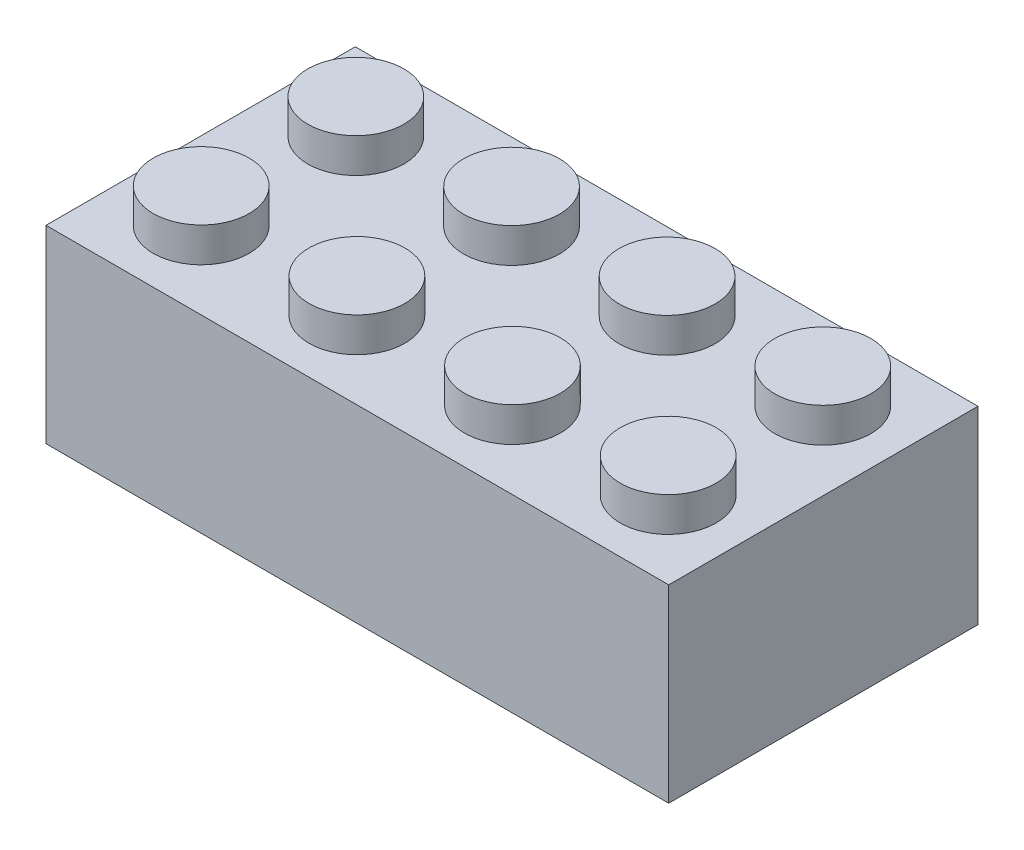
ISO-10303-21;
HEADER;
FILE_DESCRIPTION(('STEP AP214'),'2;1');
FILE_NAME('part.step','',(''),(''),'','','');
FILE_SCHEMA(('AUTOMOTIVE_DESIGN { 1 0 10303 214 1 1 1 1 }'));
ENDSEC;
DATA;
#1=APPLICATION_CONTEXT('core data for automotive mechanical design processes');
#2=APPLICATION_PROTOCOL_DEFINITION('international standard','automotive_design',2000,#1);
#3=PRODUCT_CONTEXT('',#1,'mechanical');
#4=PRODUCT('Part','Part','',(#3));
#5=PRODUCT_RELATED_PRODUCT_CATEGORY('part','',(#4));
#6=PRODUCT_DEFINITION_FORMATION('','',#4);
#7=PRODUCT_DEFINITION_CONTEXT('part definition',#1,'design');
#8=PRODUCT_DEFINITION('design','',#6,#7);
#9=PRODUCT_DEFINITION_SHAPE('','',#8);
#10=(LENGTH_UNIT() NAMED_UNIT(*) SI_UNIT(.MILLI.,.METRE.));
#11=(NAMED_UNIT(*) PLANE_ANGLE_UNIT() SI_UNIT($,.RADIAN.));
#12=(NAMED_UNIT(*) SI_UNIT($,.STERADIAN.) SOLID_ANGLE_UNIT());
#13=UNCERTAINTY_MEASURE_WITH_UNIT(LENGTH_MEASURE(1.E-05),#10,'distance_accuracy_value','');
#14=(GEOMETRIC_REPRESENTATION_CONTEXT(3) GLOBAL_UNCERTAINTY_ASSIGNED_CONTEXT((#13)) GLOBAL_UNIT_ASSIGNED_CONTEXT((#10,
#11,#12)) REPRESENTATION_CONTEXT('',''));
#15=CARTESIAN_POINT('',(0.,0.,0.));
#16=DIRECTION('',(0.,0.,1.));
#17=DIRECTION('',(1.,0.,0.));
#18=AXIS2_PLACEMENT_3D('',#15,#16,#17);
#19=CARTESIAN_POINT('',(15.885,-9.65,-7.89));
#20=DIRECTION('',(1.,0.,0.));
#21=DIRECTION('',(0.,0.,-1.));
#22=AXIS2_PLACEMENT_3D('',#19,#20,#21);
#23=PLANE('',#22);
#24=DIRECTION('',(0.,0.,-1.));
#25=VECTOR('',#24,1.);
#26=CARTESIAN_POINT('',(15.885,0.,-7.89));
#27=LINE('',#26,#25);
#28=CARTESIAN_POINT('',(15.885,0.,7.89));
#29=VERTEX_POINT('',#28);
#30=CARTESIAN_POINT('',(15.885,0.,-7.89));
#31=VERTEX_POINT('',#30);
#32=EDGE_CURVE('E243',#29,#31,#27,.T.);
#33=ORIENTED_EDGE('',*,*,#32,.F.);
#34=DIRECTION('',(0.,1.,0.));
#35=VECTOR('',#34,1.);
#36=CARTESIAN_POINT('',(15.885,-9.65,7.89));
#37=LINE('',#36,#35);
#38=CARTESIAN_POINT('',(15.885,-9.65,7.89));
#39=VERTEX_POINT('',#38);
#40=EDGE_CURVE('E58',#39,#29,#37,.T.);
#41=ORIENTED_EDGE('',*,*,#40,.F.);
#42=DIRECTION('',(0.,0.,-1.));
#43=VECTOR('',#42,1.);
#44=CARTESIAN_POINT('',(15.885,-9.65,-7.89));
#45=LINE('',#44,#43);
#46=CARTESIAN_POINT('',(15.885,-9.65,-7.89));
#47=VERTEX_POINT('',#46);
#48=EDGE_CURVE('E246',#39,#47,#45,.T.);
#49=ORIENTED_EDGE('',*,*,#48,.T.);
#50=DIRECTION('',(0.,1.,0.));
#51=VECTOR('',#50,1.);
#52=CARTESIAN_POINT('',(15.885,-9.65,-7.89));
#53=LINE('',#52,#51);
#54=EDGE_CURVE('E84',#47,#31,#53,.T.);
#55=ORIENTED_EDGE('',*,*,#54,.T.);
#56=EDGE_LOOP('',(#33,#41,#49,#55));
#57=FACE_BOUND('',#56,.T.);
#58=ADVANCED_FACE('F35',(#57),#23,.T.);
#59=CARTESIAN_POINT('',(-15.885,-9.65,7.89));
#60=DIRECTION('',(0.,0.,1.));
#61=DIRECTION('',(1.,0.,0.));
#62=AXIS2_PLACEMENT_3D('',#59,#60,#61);
#63=PLANE('',#62);
#64=DIRECTION('',(1.,0.,0.));
#65=VECTOR('',#64,1.);
#66=CARTESIAN_POINT('',(-15.885,0.,7.89));
#67=LINE('',#66,#65);
#68=CARTESIAN_POINT('',(-15.885,0.,7.89));
#69=VERTEX_POINT('',#68);
#70=EDGE_CURVE('E249',#69,#29,#67,.T.);
#71=ORIENTED_EDGE('',*,*,#70,.F.);
#72=DIRECTION('',(0.,1.,0.));
#73=VECTOR('',#72,1.);
#74=CARTESIAN_POINT('',(-15.885,-9.65,7.89));
#75=LINE('',#74,#73);
#76=CARTESIAN_POINT('',(-15.885,-9.65,7.89));
#77=VERTEX_POINT('',#76);
#78=EDGE_CURVE('E268',#77,#69,#75,.T.);
#79=ORIENTED_EDGE('',*,*,#78,.F.);
#80=DIRECTION('',(1.,0.,0.));
#81=VECTOR('',#80,1.);
#82=CARTESIAN_POINT('',(-15.885,-9.65,7.89));
#83=LINE('',#82,#81);
#84=EDGE_CURVE('E254',#77,#39,#83,.T.);
#85=ORIENTED_EDGE('',*,*,#84,.T.);
#86=ORIENTED_EDGE('',*,*,#40,.T.);
#87=EDGE_LOOP('',(#71,#79,#85,#86));
#88=FACE_BOUND('',#87,.T.);
#89=ADVANCED_FACE('F316',(#88),#63,.T.);
#90=CARTESIAN_POINT('',(-15.885,-9.65,-7.89));
#91=DIRECTION('',(-1.,0.,0.));
#92=DIRECTION('',(0.,0.,1.));
#93=AXIS2_PLACEMENT_3D('',#90,#91,#92);
#94=PLANE('',#93);
#95=DIRECTION('',(0.,0.,1.));
#96=VECTOR('',#95,1.);
#97=CARTESIAN_POINT('',(-15.885,0.,-7.89));
#98=LINE('',#97,#96);
#99=CARTESIAN_POINT('',(-15.885,0.,-7.89));
#100=VERTEX_POINT('',#99);
#101=EDGE_CURVE('E261',#100,#69,#98,.T.);
#102=ORIENTED_EDGE('',*,*,#101,.F.);
#103=DIRECTION('',(0.,1.,0.));
#104=VECTOR('',#103,1.);
#105=CARTESIAN_POINT('',(-15.885,-9.65,-7.89));
#106=LINE('',#105,#104);
#107=CARTESIAN_POINT('',(-15.885,-9.65,-7.89));
#108=VERTEX_POINT('',#107);
#109=EDGE_CURVE('E270',#108,#100,#106,.T.);
#110=ORIENTED_EDGE('',*,*,#109,.F.);
#111=DIRECTION('',(0.,0.,1.));
#112=VECTOR('',#111,1.);
#113=CARTESIAN_POINT('',(-15.885,-9.65,-7.89));
#114=LINE('',#113,#112);
#115=EDGE_CURVE('E251',#108,#77,#114,.T.);
#116=ORIENTED_EDGE('',*,*,#115,.T.);
#117=ORIENTED_EDGE('',*,*,#78,.T.);
#118=EDGE_LOOP('',(#102,#110,#116,#117));
#119=FACE_BOUND('',#118,.T.);
#120=ADVANCED_FACE('F320',(#119),#94,.T.);
#121=CARTESIAN_POINT('',(-15.885,-9.65,-7.89));
#122=DIRECTION('',(0.,0.,-1.));
#123=DIRECTION('',(-1.,0.,0.));
#124=AXIS2_PLACEMENT_3D('',#121,#122,#123);
#125=PLANE('',#124);
#126=DIRECTION('',(-1.,0.,0.));
#127=VECTOR('',#126,1.);
#128=CARTESIAN_POINT('',(-15.885,0.,-7.89));
#129=LINE('',#128,#127);
#130=EDGE_CURVE('E258',#31,#100,#129,.T.);
#131=ORIENTED_EDGE('',*,*,#130,.F.);
#132=ORIENTED_EDGE('',*,*,#54,.F.);
#133=DIRECTION('',(-1.,0.,0.));
#134=VECTOR('',#133,1.);
#135=CARTESIAN_POINT('',(-15.885,-9.65,-7.89));
#136=LINE('',#135,#134);
#137=EDGE_CURVE('E248',#47,#108,#136,.T.);
#138=ORIENTED_EDGE('',*,*,#137,.T.);
#139=ORIENTED_EDGE('',*,*,#109,.T.);
#140=EDGE_LOOP('',(#131,#132,#138,#139));
#141=FACE_BOUND('',#140,.T.);
#142=ADVANCED_FACE('F330',(#141),#125,.T.);
#143=CARTESIAN_POINT('',(0.,-9.65,0.));
#144=DIRECTION('',(0.,1.,0.));
#145=DIRECTION('',(0.,0.,1.));
#146=AXIS2_PLACEMENT_3D('',#143,#144,#145);
#147=PLANE('',#146);
#148=DIRECTION('',(1.,0.,0.));
#149=VECTOR('',#148,1.);
#150=CARTESIAN_POINT('',(0.,-9.65,6.69));
#151=LINE('',#150,#149);
#152=CARTESIAN_POINT('',(-14.685,-9.65,6.69));
#153=VERTEX_POINT('',#152);
#154=CARTESIAN_POINT('',(14.685,-9.65,6.69));
#155=VERTEX_POINT('',#154);
#156=EDGE_CURVE('E193',#153,#155,#151,.T.);
#157=ORIENTED_EDGE('',*,*,#156,.T.);
#158=DIRECTION('',(0.,0.,-1.));
#159=VECTOR('',#158,1.);
#160=CARTESIAN_POINT('',(14.685,-9.65,0.));
#161=LINE('',#160,#159);
#162=CARTESIAN_POINT('',(14.685,-9.65,-6.69));
#163=VERTEX_POINT('',#162);
#164=EDGE_CURVE('E113',#155,#163,#161,.T.);
#165=ORIENTED_EDGE('',*,*,#164,.T.);
#166=DIRECTION('',(-1.,0.,0.));
#167=VECTOR('',#166,1.);
#168=CARTESIAN_POINT('',(0.,-9.65,-6.69));
#169=LINE('',#168,#167);
#170=CARTESIAN_POINT('',(-14.685,-9.65,-6.69));
#171=VERTEX_POINT('',#170);
#172=EDGE_CURVE('E135',#163,#171,#169,.T.);
#173=ORIENTED_EDGE('',*,*,#172,.T.);
#174=DIRECTION('',(0.,0.,1.));
#175=VECTOR('',#174,1.);
#176=CARTESIAN_POINT('',(-14.685,-9.65,0.));
#177=LINE('',#176,#175);
#178=EDGE_CURVE('E49',#171,#153,#177,.T.);
#179=ORIENTED_EDGE('',*,*,#178,.T.);
#180=EDGE_LOOP('',(#157,#165,#173,#179));
#181=FACE_BOUND('',#180,.T.);
#182=ORIENTED_EDGE('',*,*,#48,.F.);
#183=ORIENTED_EDGE('',*,*,#84,.F.);
#184=ORIENTED_EDGE('',*,*,#115,.F.);
#185=ORIENTED_EDGE('',*,*,#137,.F.);
#186=EDGE_LOOP('',(#182,#183,#184,#185));
#187=FACE_BOUND('',#186,.T.);
#188=ADVANCED_FACE('F329',(#181,#187),#147,.F.);
#189=CARTESIAN_POINT('',(0.,0.,0.));
#190=DIRECTION('',(0.,1.,0.));
#191=DIRECTION('',(0.,0.,1.));
#192=AXIS2_PLACEMENT_3D('',#189,#190,#191);
#193=PLANE('',#192);
#194=CARTESIAN_POINT('',(11.9125,0.,-3.945));
#195=DIRECTION('',(0.,1.,0.));
#196=DIRECTION('',(0.,0.,-1.));
#197=AXIS2_PLACEMENT_3D('',#194,#195,#196);
#198=CIRCLE('',#197,2.45);
#199=CARTESIAN_POINT('',(11.9125,0.,-6.395));
#200=VERTEX_POINT('',#199);
#201=EDGE_CURVE('E118',#200,#200,#198,.T.);
#202=ORIENTED_EDGE('',*,*,#201,.F.);
#203=EDGE_LOOP('',(#202));
#204=FACE_BOUND('',#203,.T.);
#205=CARTESIAN_POINT('',(3.9675,0.,-3.945));
#206=DIRECTION('',(0.,1.,0.));
#207=DIRECTION('',(0.,0.,-1.));
#208=AXIS2_PLACEMENT_3D('',#205,#206,#207);
#209=CIRCLE('',#208,2.45);
#210=CARTESIAN_POINT('',(3.9675,0.,-6.395));
#211=VERTEX_POINT('',#210);
#212=EDGE_CURVE('E201',#211,#211,#209,.T.);
#213=ORIENTED_EDGE('',*,*,#212,.F.);
#214=EDGE_LOOP('',(#213));
#215=FACE_BOUND('',#214,.T.);
#216=CARTESIAN_POINT('',(3.9675,0.,3.945));
#217=DIRECTION('',(0.,1.,0.));
#218=DIRECTION('',(0.,0.,-1.));
#219=AXIS2_PLACEMENT_3D('',#216,#217,#218);
#220=CIRCLE('',#219,2.45);
#221=CARTESIAN_POINT('',(3.9675,0.,1.495));
#222=VERTEX_POINT('',#221);
#223=EDGE_CURVE('E207',#222,#222,#220,.T.);
#224=ORIENTED_EDGE('',*,*,#223,.F.);
#225=EDGE_LOOP('',(#224));
#226=FACE_BOUND('',#225,.T.);
#227=CARTESIAN_POINT('',(11.9125,0.,3.945));
#228=DIRECTION('',(0.,1.,0.));
#229=DIRECTION('',(0.,0.,-1.));
#230=AXIS2_PLACEMENT_3D('',#227,#228,#229);
#231=CIRCLE('',#230,2.45);
#232=CARTESIAN_POINT('',(11.9125,0.,1.495));
#233=VERTEX_POINT('',#232);
#234=EDGE_CURVE('E213',#233,#233,#231,.T.);
#235=ORIENTED_EDGE('',*,*,#234,.F.);
#236=EDGE_LOOP('',(#235));
#237=FACE_BOUND('',#236,.T.);
#238=CARTESIAN_POINT('',(-11.9125,0.,3.945));
#239=DIRECTION('',(0.,1.,0.));
#240=DIRECTION('',(0.,0.,1.));
#241=AXIS2_PLACEMENT_3D('',#238,#239,#240);
#242=CIRCLE('',#241,2.45);
#243=CARTESIAN_POINT('',(-11.9125,0.,6.395));
#244=VERTEX_POINT('',#243);
#245=EDGE_CURVE('E219',#244,#244,#242,.T.);
#246=ORIENTED_EDGE('',*,*,#245,.F.);
#247=EDGE_LOOP('',(#246));
#248=FACE_BOUND('',#247,.T.);
#249=CARTESIAN_POINT('',(-3.9675,0.,3.945));
#250=DIRECTION('',(0.,1.,0.));
#251=DIRECTION('',(0.,0.,1.));
#252=AXIS2_PLACEMENT_3D('',#249,#250,#251);
#253=CIRCLE('',#252,2.45);
#254=CARTESIAN_POINT('',(-3.9675,0.,6.395));
#255=VERTEX_POINT('',#254);
#256=EDGE_CURVE('E225',#255,#255,#253,.T.);
#257=ORIENTED_EDGE('',*,*,#256,.F.);
#258=EDGE_LOOP('',(#257));
#259=FACE_BOUND('',#258,.T.);
#260=CARTESIAN_POINT('',(-3.9675,0.,-3.945));
#261=DIRECTION('',(0.,1.,0.));
#262=DIRECTION('',(0.,0.,1.));
#263=AXIS2_PLACEMENT_3D('',#260,#261,#262);
#264=CIRCLE('',#263,2.45);
#265=CARTESIAN_POINT('',(-3.9675,0.,-1.495));
#266=VERTEX_POINT('',#265);
#267=EDGE_CURVE('E231',#266,#266,#264,.T.);
#268=ORIENTED_EDGE('',*,*,#267,.F.);
#269=EDGE_LOOP('',(#268));
#270=FACE_BOUND('',#269,.T.);
#271=CARTESIAN_POINT('',(-11.9125,0.,-3.945));
#272=DIRECTION('',(0.,1.,0.));
#273=DIRECTION('',(0.,0.,1.));
#274=AXIS2_PLACEMENT_3D('',#271,#272,#273);
#275=CIRCLE('',#274,2.45);
#276=CARTESIAN_POINT('',(-11.9125,0.,-1.495));
#277=VERTEX_POINT('',#276);
#278=EDGE_CURVE('E237',#277,#277,#275,.T.);
#279=ORIENTED_EDGE('',*,*,#278,.F.);
#280=EDGE_LOOP('',(#279));
#281=FACE_BOUND('',#280,.T.);
#282=ORIENTED_EDGE('',*,*,#32,.T.);
#283=ORIENTED_EDGE('',*,*,#130,.T.);
#284=ORIENTED_EDGE('',*,*,#101,.T.);
#285=ORIENTED_EDGE('',*,*,#70,.T.);
#286=EDGE_LOOP('',(#282,#283,#284,#285));
#287=FACE_BOUND('',#286,.T.);
#288=ADVANCED_FACE('F323',(#204,#215,#226,#237,#248,#259,#270,#281,#287),#193,.T.);
#289=CARTESIAN_POINT('',(-11.9125,1.76,-3.945));
#290=DIRECTION('',(0.,-1.,0.));
#291=DIRECTION('',(0.,0.,-1.));
#292=AXIS2_PLACEMENT_3D('',#289,#290,#291);
#293=CYLINDRICAL_SURFACE('',#292,2.45);
#294=CARTESIAN_POINT('',(-11.9125,1.76,-3.945));
#295=DIRECTION('',(0.,1.,0.));
#296=DIRECTION('',(0.,0.,1.));
#297=AXIS2_PLACEMENT_3D('',#294,#295,#296);
#298=CIRCLE('',#297,2.45);
#299=CARTESIAN_POINT('',(-11.9125,1.76,-1.495));
#300=VERTEX_POINT('',#299);
#301=EDGE_CURVE('E240',#300,#300,#298,.T.);
#302=ORIENTED_EDGE('',*,*,#301,.F.);
#303=EDGE_LOOP('',(#302));
#304=FACE_BOUND('',#303,.T.);
#305=ORIENTED_EDGE('',*,*,#278,.T.);
#306=EDGE_LOOP('',(#305));
#307=FACE_BOUND('',#306,.T.);
#308=ADVANCED_FACE('F341',(#304,#307),#293,.T.);
#309=CARTESIAN_POINT('',(-11.9125,1.76,-3.945));
#310=DIRECTION('',(0.,1.,0.));
#311=DIRECTION('',(0.,0.,1.));
#312=AXIS2_PLACEMENT_3D('',#309,#310,#311);
#313=PLANE('',#312);
#314=ORIENTED_EDGE('',*,*,#301,.T.);
#315=EDGE_LOOP('',(#314));
#316=FACE_BOUND('',#315,.T.);
#317=ADVANCED_FACE('F346',(#316),#313,.T.);
#318=CARTESIAN_POINT('',(-3.9675,1.76,-3.945));
#319=DIRECTION('',(0.,-1.,0.));
#320=DIRECTION('',(0.,0.,-1.));
#321=AXIS2_PLACEMENT_3D('',#318,#319,#320);
#322=CYLINDRICAL_SURFACE('',#321,2.45);
#323=CARTESIAN_POINT('',(-3.9675,1.76,-3.945));
#324=DIRECTION('',(0.,1.,0.));
#325=DIRECTION('',(0.,0.,1.));
#326=AXIS2_PLACEMENT_3D('',#323,#324,#325);
#327=CIRCLE('',#326,2.45);
#328=CARTESIAN_POINT('',(-3.9675,1.76,-1.495));
#329=VERTEX_POINT('',#328);
#330=EDGE_CURVE('E234',#329,#329,#327,.T.);
#331=ORIENTED_EDGE('',*,*,#330,.F.);
#332=EDGE_LOOP('',(#331));
#333=FACE_BOUND('',#332,.T.);
#334=ORIENTED_EDGE('',*,*,#267,.T.);
#335=EDGE_LOOP('',(#334));
#336=FACE_BOUND('',#335,.T.);
#337=ADVANCED_FACE('F350',(#333,#336),#322,.T.);
#338=CARTESIAN_POINT('',(-3.9675,1.76,-3.945));
#339=DIRECTION('',(0.,1.,0.));
#340=DIRECTION('',(0.,0.,1.));
#341=AXIS2_PLACEMENT_3D('',#338,#339,#340);
#342=PLANE('',#341);
#343=ORIENTED_EDGE('',*,*,#330,.T.);
#344=EDGE_LOOP('',(#343));
#345=FACE_BOUND('',#344,.T.);
#346=ADVANCED_FACE('F354',(#345),#342,.T.);
#347=CARTESIAN_POINT('',(-3.9675,1.76,3.945));
#348=DIRECTION('',(0.,-1.,0.));
#349=DIRECTION('',(0.,0.,-1.));
#350=AXIS2_PLACEMENT_3D('',#347,#348,#349);
#351=CYLINDRICAL_SURFACE('',#350,2.45);
#352=CARTESIAN_POINT('',(-3.9675,1.76,3.945));
#353=DIRECTION('',(0.,1.,0.));
#354=DIRECTION('',(0.,0.,1.));
#355=AXIS2_PLACEMENT_3D('',#352,#353,#354);
#356=CIRCLE('',#355,2.45);
#357=CARTESIAN_POINT('',(-3.9675,1.76,6.395));
#358=VERTEX_POINT('',#357);
#359=EDGE_CURVE('E228',#358,#358,#356,.T.);
#360=ORIENTED_EDGE('',*,*,#359,.F.);
#361=EDGE_LOOP('',(#360));
#362=FACE_BOUND('',#361,.T.);
#363=ORIENTED_EDGE('',*,*,#256,.T.);
#364=EDGE_LOOP('',(#363));
#365=FACE_BOUND('',#364,.T.);
#366=ADVANCED_FACE('F358',(#362,#365),#351,.T.);
#367=CARTESIAN_POINT('',(-3.9675,1.76,3.945));
#368=DIRECTION('',(0.,1.,0.));
#369=DIRECTION('',(0.,0.,1.));
#370=AXIS2_PLACEMENT_3D('',#367,#368,#369);
#371=PLANE('',#370);
#372=ORIENTED_EDGE('',*,*,#359,.T.);
#373=EDGE_LOOP('',(#372));
#374=FACE_BOUND('',#373,.T.);
#375=ADVANCED_FACE('F362',(#374),#371,.T.);
#376=CARTESIAN_POINT('',(-11.9125,1.76,3.945));
#377=DIRECTION('',(0.,-1.,0.));
#378=DIRECTION('',(0.,0.,-1.));
#379=AXIS2_PLACEMENT_3D('',#376,#377,#378);
#380=CYLINDRICAL_SURFACE('',#379,2.45);
#381=CARTESIAN_POINT('',(-11.9125,1.76,3.945));
#382=DIRECTION('',(0.,1.,0.));
#383=DIRECTION('',(0.,0.,1.));
#384=AXIS2_PLACEMENT_3D('',#381,#382,#383);
#385=CIRCLE('',#384,2.45);
#386=CARTESIAN_POINT('',(-11.9125,1.76,6.395));
#387=VERTEX_POINT('',#386);
#388=EDGE_CURVE('E222',#387,#387,#385,.T.);
#389=ORIENTED_EDGE('',*,*,#388,.F.);
#390=EDGE_LOOP('',(#389));
#391=FACE_BOUND('',#390,.T.);
#392=ORIENTED_EDGE('',*,*,#245,.T.);
#393=EDGE_LOOP('',(#392));
#394=FACE_BOUND('',#393,.T.);
#395=ADVANCED_FACE('F366',(#391,#394),#380,.T.);
#396=CARTESIAN_POINT('',(-11.9125,1.76,3.945));
#397=DIRECTION('',(0.,1.,0.));
#398=DIRECTION('',(0.,0.,1.));
#399=AXIS2_PLACEMENT_3D('',#396,#397,#398);
#400=PLANE('',#399);
#401=ORIENTED_EDGE('',*,*,#388,.T.);
#402=EDGE_LOOP('',(#401));
#403=FACE_BOUND('',#402,.T.);
#404=ADVANCED_FACE('F370',(#403),#400,.T.);
#405=CARTESIAN_POINT('',(11.9125,1.76,3.945));
#406=DIRECTION('',(0.,-1.,0.));
#407=DIRECTION('',(0.,0.,-1.));
#408=AXIS2_PLACEMENT_3D('',#405,#406,#407);
#409=CYLINDRICAL_SURFACE('',#408,2.45);
#410=CARTESIAN_POINT('',(11.9125,1.76,3.945));
#411=DIRECTION('',(0.,1.,0.));
#412=DIRECTION('',(0.,0.,-1.));
#413=AXIS2_PLACEMENT_3D('',#410,#411,#412);
#414=CIRCLE('',#413,2.45);
#415=CARTESIAN_POINT('',(11.9125,1.76,1.495));
#416=VERTEX_POINT('',#415);
#417=EDGE_CURVE('E216',#416,#416,#414,.T.);
#418=ORIENTED_EDGE('',*,*,#417,.F.);
#419=EDGE_LOOP('',(#418));
#420=FACE_BOUND('',#419,.T.);
#421=ORIENTED_EDGE('',*,*,#234,.T.);
#422=EDGE_LOOP('',(#421));
#423=FACE_BOUND('',#422,.T.);
#424=ADVANCED_FACE('F374',(#420,#423),#409,.T.);
#425=CARTESIAN_POINT('',(11.9125,1.76,3.945));
#426=DIRECTION('',(0.,-1.,0.));
#427=DIRECTION('',(0.,0.,-1.));
#428=AXIS2_PLACEMENT_3D('',#425,#426,#427);
#429=PLANE('',#428);
#430=ORIENTED_EDGE('',*,*,#417,.T.);
#431=EDGE_LOOP('',(#430));
#432=FACE_BOUND('',#431,.T.);
#433=ADVANCED_FACE('F378',(#432),#429,.F.);
#434=CARTESIAN_POINT('',(3.9675,1.76,3.945));
#435=DIRECTION('',(0.,-1.,0.));
#436=DIRECTION('',(0.,0.,-1.));
#437=AXIS2_PLACEMENT_3D('',#434,#435,#436);
#438=CYLINDRICAL_SURFACE('',#437,2.45);
#439=CARTESIAN_POINT('',(3.9675,1.76,3.945));
#440=DIRECTION('',(0.,1.,0.));
#441=DIRECTION('',(0.,0.,-1.));
#442=AXIS2_PLACEMENT_3D('',#439,#440,#441);
#443=CIRCLE('',#442,2.45);
#444=CARTESIAN_POINT('',(3.9675,1.76,1.495));
#445=VERTEX_POINT('',#444);
#446=EDGE_CURVE('E210',#445,#445,#443,.T.);
#447=ORIENTED_EDGE('',*,*,#446,.F.);
#448=EDGE_LOOP('',(#447));
#449=FACE_BOUND('',#448,.T.);
#450=ORIENTED_EDGE('',*,*,#223,.T.);
#451=EDGE_LOOP('',(#450));
#452=FACE_BOUND('',#451,.T.);
#453=ADVANCED_FACE('F382',(#449,#452),#438,.T.);
#454=CARTESIAN_POINT('',(3.9675,1.76,3.945));
#455=DIRECTION('',(0.,-1.,0.));
#456=DIRECTION('',(0.,0.,-1.));
#457=AXIS2_PLACEMENT_3D('',#454,#455,#456);
#458=PLANE('',#457);
#459=ORIENTED_EDGE('',*,*,#446,.T.);
#460=EDGE_LOOP('',(#459));
#461=FACE_BOUND('',#460,.T.);
#462=ADVANCED_FACE('F386',(#461),#458,.F.);
#463=CARTESIAN_POINT('',(3.9675,1.76,-3.945));
#464=DIRECTION('',(0.,-1.,0.));
#465=DIRECTION('',(0.,0.,-1.));
#466=AXIS2_PLACEMENT_3D('',#463,#464,#465);
#467=CYLINDRICAL_SURFACE('',#466,2.45);
#468=CARTESIAN_POINT('',(3.9675,1.76,-3.945));
#469=DIRECTION('',(0.,1.,0.));
#470=DIRECTION('',(0.,0.,-1.));
#471=AXIS2_PLACEMENT_3D('',#468,#469,#470);
#472=CIRCLE('',#471,2.45);
#473=CARTESIAN_POINT('',(3.9675,1.76,-6.395));
#474=VERTEX_POINT('',#473);
#475=EDGE_CURVE('E204',#474,#474,#472,.T.);
#476=ORIENTED_EDGE('',*,*,#475,.F.);
#477=EDGE_LOOP('',(#476));
#478=FACE_BOUND('',#477,.T.);
#479=ORIENTED_EDGE('',*,*,#212,.T.);
#480=EDGE_LOOP('',(#479));
#481=FACE_BOUND('',#480,.T.);
#482=ADVANCED_FACE('F390',(#478,#481),#467,.T.);
#483=CARTESIAN_POINT('',(3.9675,1.76,-3.945));
#484=DIRECTION('',(0.,-1.,0.));
#485=DIRECTION('',(0.,0.,-1.));
#486=AXIS2_PLACEMENT_3D('',#483,#484,#485);
#487=PLANE('',#486);
#488=ORIENTED_EDGE('',*,*,#475,.T.);
#489=EDGE_LOOP('',(#488));
#490=FACE_BOUND('',#489,.T.);
#491=ADVANCED_FACE('F394',(#490),#487,.F.);
#492=CARTESIAN_POINT('',(11.9125,1.76,-3.945));
#493=DIRECTION('',(0.,-1.,0.));
#494=DIRECTION('',(0.,0.,-1.));
#495=AXIS2_PLACEMENT_3D('',#492,#493,#494);
#496=CYLINDRICAL_SURFACE('',#495,2.45);
#497=CARTESIAN_POINT('',(11.9125,1.76,-3.945));
#498=DIRECTION('',(0.,1.,0.));
#499=DIRECTION('',(0.,0.,-1.));
#500=AXIS2_PLACEMENT_3D('',#497,#498,#499);
#501=CIRCLE('',#500,2.45);
#502=CARTESIAN_POINT('',(11.9125,1.76,-6.395));
#503=VERTEX_POINT('',#502);
#504=EDGE_CURVE('E198',#503,#503,#501,.T.);
#505=ORIENTED_EDGE('',*,*,#504,.F.);
#506=EDGE_LOOP('',(#505));
#507=FACE_BOUND('',#506,.T.);
#508=ORIENTED_EDGE('',*,*,#201,.T.);
#509=EDGE_LOOP('',(#508));
#510=FACE_BOUND('',#509,.T.);
#511=ADVANCED_FACE('F398',(#507,#510),#496,.T.);
#512=CARTESIAN_POINT('',(11.9125,1.76,-3.945));
#513=DIRECTION('',(0.,-1.,0.));
#514=DIRECTION('',(0.,0.,-1.));
#515=AXIS2_PLACEMENT_3D('',#512,#513,#514);
#516=PLANE('',#515);
#517=ORIENTED_EDGE('',*,*,#504,.T.);
#518=EDGE_LOOP('',(#517));
#519=FACE_BOUND('',#518,.T.);
#520=ADVANCED_FACE('F402',(#519),#516,.F.);
#521=CARTESIAN_POINT('',(14.685,-9.65,-7.89));
#522=DIRECTION('',(1.,0.,0.));
#523=DIRECTION('',(0.,0.,-1.));
#524=AXIS2_PLACEMENT_3D('',#521,#522,#523);
#525=PLANE('',#524);
#526=DIRECTION('',(0.,0.,-1.));
#527=VECTOR('',#526,1.);
#528=CARTESIAN_POINT('',(14.685,-1.2,0.));
#529=LINE('',#528,#527);
#530=CARTESIAN_POINT('',(14.685,-1.2,6.69));
#531=VERTEX_POINT('',#530);
#532=CARTESIAN_POINT('',(14.685,-1.2,-6.69));
#533=VERTEX_POINT('',#532);
#534=EDGE_CURVE('E111',#531,#533,#529,.T.);
#535=ORIENTED_EDGE('',*,*,#534,.T.);
#536=DIRECTION('',(0.,1.,0.));
#537=VECTOR('',#536,1.);
#538=CARTESIAN_POINT('',(14.685,-9.65,-6.69));
#539=LINE('',#538,#537);
#540=EDGE_CURVE('E140',#163,#533,#539,.T.);
#541=ORIENTED_EDGE('',*,*,#540,.F.);
#542=ORIENTED_EDGE('',*,*,#164,.F.);
#543=DIRECTION('',(0.,1.,0.));
#544=VECTOR('',#543,1.);
#545=CARTESIAN_POINT('',(14.685,-9.65,6.69));
#546=LINE('',#545,#544);
#547=EDGE_CURVE('E108',#155,#531,#546,.T.);
#548=ORIENTED_EDGE('',*,*,#547,.T.);
#549=EDGE_LOOP('',(#535,#541,#542,#548));
#550=FACE_BOUND('',#549,.T.);
#551=ADVANCED_FACE('F110',(#550),#525,.F.);
#552=CARTESIAN_POINT('',(-15.885,-9.65,6.69));
#553=DIRECTION('',(0.,0.,1.));
#554=DIRECTION('',(1.,0.,0.));
#555=AXIS2_PLACEMENT_3D('',#552,#553,#554);
#556=PLANE('',#555);
#557=DIRECTION('',(1.,0.,0.));
#558=VECTOR('',#557,1.);
#559=CARTESIAN_POINT('',(0.,-1.2,6.69));
#560=LINE('',#559,#558);
#561=CARTESIAN_POINT('',(-14.685,-1.2,6.69));
#562=VERTEX_POINT('',#561);
#563=EDGE_CURVE('E126',#562,#531,#560,.T.);
#564=ORIENTED_EDGE('',*,*,#563,.T.);
#565=ORIENTED_EDGE('',*,*,#547,.F.);
#566=ORIENTED_EDGE('',*,*,#156,.F.);
#567=DIRECTION('',(0.,1.,0.));
#568=VECTOR('',#567,1.);
#569=CARTESIAN_POINT('',(-14.685,-9.65,6.69));
#570=LINE('',#569,#568);
#571=EDGE_CURVE('E119',#153,#562,#570,.T.);
#572=ORIENTED_EDGE('',*,*,#571,.T.);
#573=EDGE_LOOP('',(#564,#565,#566,#572));
#574=FACE_BOUND('',#573,.T.);
#575=ADVANCED_FACE('F131',(#574),#556,.F.);
#576=CARTESIAN_POINT('',(-14.685,-9.65,-7.89));
#577=DIRECTION('',(-1.,0.,0.));
#578=DIRECTION('',(0.,0.,1.));
#579=AXIS2_PLACEMENT_3D('',#576,#577,#578);
#580=PLANE('',#579);
#581=DIRECTION('',(0.,0.,1.));
#582=VECTOR('',#581,1.);
#583=CARTESIAN_POINT('',(-14.685,-1.2,0.));
#584=LINE('',#583,#582);
#585=CARTESIAN_POINT('',(-14.685,-1.2,-6.69));
#586=VERTEX_POINT('',#585);
#587=EDGE_CURVE('E133',#586,#562,#584,.T.);
#588=ORIENTED_EDGE('',*,*,#587,.T.);
#589=ORIENTED_EDGE('',*,*,#571,.F.);
#590=ORIENTED_EDGE('',*,*,#178,.F.);
#591=DIRECTION('',(0.,1.,0.));
#592=VECTOR('',#591,1.);
#593=CARTESIAN_POINT('',(-14.685,-9.65,-6.69));
#594=LINE('',#593,#592);
#595=EDGE_CURVE('E141',#171,#586,#594,.T.);
#596=ORIENTED_EDGE('',*,*,#595,.T.);
#597=EDGE_LOOP('',(#588,#589,#590,#596));
#598=FACE_BOUND('',#597,.T.);
#599=ADVANCED_FACE('F682',(#598),#580,.F.);
#600=CARTESIAN_POINT('',(-15.885,-9.65,-6.69));
#601=DIRECTION('',(0.,0.,-1.));
#602=DIRECTION('',(-1.,0.,0.));
#603=AXIS2_PLACEMENT_3D('',#600,#601,#602);
#604=PLANE('',#603);
#605=DIRECTION('',(-1.,0.,0.));
#606=VECTOR('',#605,1.);
#607=CARTESIAN_POINT('',(0.,-1.2,-6.69));
#608=LINE('',#607,#606);
#609=EDGE_CURVE('E128',#533,#586,#608,.T.);
#610=ORIENTED_EDGE('',*,*,#609,.T.);
#611=ORIENTED_EDGE('',*,*,#595,.F.);
#612=ORIENTED_EDGE('',*,*,#172,.F.);
#613=ORIENTED_EDGE('',*,*,#540,.T.);
#614=EDGE_LOOP('',(#610,#611,#612,#613));
#615=FACE_BOUND('',#614,.T.);
#616=ADVANCED_FACE('F282',(#615),#604,.F.);
#617=CARTESIAN_POINT('',(0.,-1.2,0.));
#618=DIRECTION('',(0.,1.,0.));
#619=DIRECTION('',(0.,0.,1.));
#620=AXIS2_PLACEMENT_3D('',#617,#618,#619);
#621=PLANE('',#620);
#622=CARTESIAN_POINT('',(-7.945,-1.2,0.));
#623=DIRECTION('',(0.,1.,0.));
#624=DIRECTION('',(0.,0.,1.));
#625=AXIS2_PLACEMENT_3D('',#622,#623,#624);
#626=CIRCLE('',#625,3.215);
#627=CARTESIAN_POINT('',(-7.945,-1.2,3.215));
#628=VERTEX_POINT('',#627);
#629=EDGE_CURVE('E12',#628,#628,#626,.F.);
#630=ORIENTED_EDGE('',*,*,#629,.F.);
#631=EDGE_LOOP('',(#630));
#632=FACE_BOUND('',#631,.T.);
#633=CARTESIAN_POINT('',(7.945,-1.2,0.));
#634=DIRECTION('',(0.,1.,0.));
#635=DIRECTION('',(0.,0.,1.));
#636=AXIS2_PLACEMENT_3D('',#633,#634,#635);
#637=CIRCLE('',#636,3.215);
#638=CARTESIAN_POINT('',(7.945,-1.2,3.215));
#639=VERTEX_POINT('',#638);
#640=EDGE_CURVE('E42',#639,#639,#637,.F.);
#641=ORIENTED_EDGE('',*,*,#640,.F.);
#642=EDGE_LOOP('',(#641));
#643=FACE_BOUND('',#642,.T.);
#644=CARTESIAN_POINT('',(0.,-1.2,0.));
#645=DIRECTION('',(0.,1.,0.));
#646=DIRECTION('',(0.,0.,1.));
#647=AXIS2_PLACEMENT_3D('',#644,#645,#646);
#648=CIRCLE('',#647,3.215);
#649=CARTESIAN_POINT('',(0.,-1.2,3.215));
#650=VERTEX_POINT('',#649);
#651=EDGE_CURVE('E267',#650,#650,#648,.F.);
#652=ORIENTED_EDGE('',*,*,#651,.F.);
#653=EDGE_LOOP('',(#652));
#654=FACE_BOUND('',#653,.T.);
#655=CARTESIAN_POINT('',(11.9125,-1.2,-3.945));
#656=DIRECTION('',(0.,1.,0.));
#657=DIRECTION('',(0.,0.,1.));
#658=AXIS2_PLACEMENT_3D('',#655,#656,#657);
#659=CIRCLE('',#658,1.25);
#660=CARTESIAN_POINT('',(11.9125,-1.2,-2.695));
#661=VERTEX_POINT('',#660);
#662=EDGE_CURVE('E145',#661,#661,#659,.T.);
#663=ORIENTED_EDGE('',*,*,#662,.T.);
#664=EDGE_LOOP('',(#663));
#665=FACE_BOUND('',#664,.T.);
#666=CARTESIAN_POINT('',(3.9675,-1.2,-3.945));
#667=DIRECTION('',(0.,1.,0.));
#668=DIRECTION('',(0.,0.,1.));
#669=AXIS2_PLACEMENT_3D('',#666,#667,#668);
#670=CIRCLE('',#669,1.25);
#671=CARTESIAN_POINT('',(3.9675,-1.2,-2.695));
#672=VERTEX_POINT('',#671);
#673=EDGE_CURVE('E150',#672,#672,#670,.T.);
#674=ORIENTED_EDGE('',*,*,#673,.T.);
#675=EDGE_LOOP('',(#674));
#676=FACE_BOUND('',#675,.T.);
#677=CARTESIAN_POINT('',(3.9675,-1.2,3.945));
#678=DIRECTION('',(0.,1.,0.));
#679=DIRECTION('',(0.,0.,1.));
#680=AXIS2_PLACEMENT_3D('',#677,#678,#679);
#681=CIRCLE('',#680,1.25);
#682=CARTESIAN_POINT('',(3.9675,-1.2,5.195));
#683=VERTEX_POINT('',#682);
#684=EDGE_CURVE('E154',#683,#683,#681,.T.);
#685=ORIENTED_EDGE('',*,*,#684,.T.);
#686=EDGE_LOOP('',(#685));
#687=FACE_BOUND('',#686,.T.);
#688=CARTESIAN_POINT('',(11.9125,-1.2,3.945));
#689=DIRECTION('',(0.,1.,0.));
#690=DIRECTION('',(0.,0.,1.));
#691=AXIS2_PLACEMENT_3D('',#688,#689,#690);
#692=CIRCLE('',#691,1.25);
#693=CARTESIAN_POINT('',(11.9125,-1.2,5.195));
#694=VERTEX_POINT('',#693);
#695=EDGE_CURVE('E158',#694,#694,#692,.T.);
#696=ORIENTED_EDGE('',*,*,#695,.T.);
#697=EDGE_LOOP('',(#696));
#698=FACE_BOUND('',#697,.T.);
#699=CARTESIAN_POINT('',(-11.9125,-1.2,3.945));
#700=DIRECTION('',(0.,1.,0.));
#701=DIRECTION('',(0.,0.,1.));
#702=AXIS2_PLACEMENT_3D('',#699,#700,#701);
#703=CIRCLE('',#702,1.25);
#704=CARTESIAN_POINT('',(-11.9125,-1.2,5.195));
#705=VERTEX_POINT('',#704);
#706=EDGE_CURVE('E162',#705,#705,#703,.T.);
#707=ORIENTED_EDGE('',*,*,#706,.T.);
#708=EDGE_LOOP('',(#707));
#709=FACE_BOUND('',#708,.T.);
#710=CARTESIAN_POINT('',(-3.9675,-1.2,3.945));
#711=DIRECTION('',(0.,1.,0.));
#712=DIRECTION('',(0.,0.,1.));
#713=AXIS2_PLACEMENT_3D('',#710,#711,#712);
#714=CIRCLE('',#713,1.25);
#715=CARTESIAN_POINT('',(-3.9675,-1.2,5.195));
#716=VERTEX_POINT('',#715);
#717=EDGE_CURVE('E166',#716,#716,#714,.T.);
#718=ORIENTED_EDGE('',*,*,#717,.T.);
#719=EDGE_LOOP('',(#718));
#720=FACE_BOUND('',#719,.T.);
#721=CARTESIAN_POINT('',(-3.9675,-1.2,-3.945));
#722=DIRECTION('',(0.,1.,0.));
#723=DIRECTION('',(0.,0.,1.));
#724=AXIS2_PLACEMENT_3D('',#721,#722,#723);
#725=CIRCLE('',#724,1.25);
#726=CARTESIAN_POINT('',(-3.9675,-1.2,-2.695));
#727=VERTEX_POINT('',#726);
#728=EDGE_CURVE('E170',#727,#727,#725,.T.);
#729=ORIENTED_EDGE('',*,*,#728,.T.);
#730=EDGE_LOOP('',(#729));
#731=FACE_BOUND('',#730,.T.);
#732=CARTESIAN_POINT('',(-11.9125,-1.2,-3.945));
#733=DIRECTION('',(0.,1.,0.));
#734=DIRECTION('',(0.,0.,1.));
#735=AXIS2_PLACEMENT_3D('',#732,#733,#734);
#736=CIRCLE('',#735,1.25);
#737=CARTESIAN_POINT('',(-11.9125,-1.2,-2.695));
#738=VERTEX_POINT('',#737);
#739=EDGE_CURVE('E174',#738,#738,#736,.T.);
#740=ORIENTED_EDGE('',*,*,#739,.T.);
#741=EDGE_LOOP('',(#740));
#742=FACE_BOUND('',#741,.T.);
#743=ORIENTED_EDGE('',*,*,#534,.F.);
#744=ORIENTED_EDGE('',*,*,#563,.F.);
#745=ORIENTED_EDGE('',*,*,#587,.F.);
#746=ORIENTED_EDGE('',*,*,#609,.F.);
#747=EDGE_LOOP('',(#743,#744,#745,#746));
#748=FACE_BOUND('',#747,.T.);
#749=ADVANCED_FACE('F124',(#632,#643,#654,#665,#676,#687,#698,#709,#720,#731,#742,#748),#621,.F.);
#750=CARTESIAN_POINT('',(-11.9125,1.76,-3.945));
#751=DIRECTION('',(0.,-1.,0.));
#752=DIRECTION('',(0.,0.,-1.));
#753=AXIS2_PLACEMENT_3D('',#750,#751,#752);
#754=CYLINDRICAL_SURFACE('',#753,1.25);
#755=CARTESIAN_POINT('',(-11.9125,0.56,-3.945));
#756=DIRECTION('',(0.,1.,0.));
#757=DIRECTION('',(0.,0.,1.));
#758=AXIS2_PLACEMENT_3D('',#755,#756,#757);
#759=CIRCLE('',#758,1.25);
#760=CARTESIAN_POINT('',(-11.9125,0.56,-2.695));
#761=VERTEX_POINT('',#760);
#762=EDGE_CURVE('E129',#761,#761,#759,.T.);
#763=ORIENTED_EDGE('',*,*,#762,.T.);
#764=EDGE_LOOP('',(#763));
#765=FACE_BOUND('',#764,.T.);
#766=ORIENTED_EDGE('',*,*,#739,.F.);
#767=EDGE_LOOP('',(#766));
#768=FACE_BOUND('',#767,.T.);
#769=ADVANCED_FACE('F281',(#765,#768),#754,.F.);
#770=CARTESIAN_POINT('',(-11.9125,0.56,-3.945));
#771=DIRECTION('',(0.,1.,0.));
#772=DIRECTION('',(0.,0.,1.));
#773=AXIS2_PLACEMENT_3D('',#770,#771,#772);
#774=PLANE('',#773);
#775=ORIENTED_EDGE('',*,*,#762,.F.);
#776=EDGE_LOOP('',(#775));
#777=FACE_BOUND('',#776,.T.);
#778=ADVANCED_FACE('F306',(#777),#774,.F.);
#779=CARTESIAN_POINT('',(-3.9675,1.76,-3.945));
#780=DIRECTION('',(0.,-1.,0.));
#781=DIRECTION('',(0.,0.,-1.));
#782=AXIS2_PLACEMENT_3D('',#779,#780,#781);
#783=CYLINDRICAL_SURFACE('',#782,1.25);
#784=CARTESIAN_POINT('',(-3.9675,0.56,-3.945));
#785=DIRECTION('',(0.,1.,0.));
#786=DIRECTION('',(0.,0.,1.));
#787=AXIS2_PLACEMENT_3D('',#784,#785,#786);
#788=CIRCLE('',#787,1.25);
#789=CARTESIAN_POINT('',(-3.9675,0.56,-2.695));
#790=VERTEX_POINT('',#789);
#791=EDGE_CURVE('E173',#790,#790,#788,.T.);
#792=ORIENTED_EDGE('',*,*,#791,.T.);
#793=EDGE_LOOP('',(#792));
#794=FACE_BOUND('',#793,.T.);
#795=ORIENTED_EDGE('',*,*,#728,.F.);
#796=EDGE_LOOP('',(#795));
#797=FACE_BOUND('',#796,.T.);
#798=ADVANCED_FACE('F312',(#794,#797),#783,.F.);
#799=CARTESIAN_POINT('',(-3.9675,0.56,-3.945));
#800=DIRECTION('',(0.,1.,0.));
#801=DIRECTION('',(0.,0.,1.));
#802=AXIS2_PLACEMENT_3D('',#799,#800,#801);
#803=PLANE('',#802);
#804=ORIENTED_EDGE('',*,*,#791,.F.);
#805=EDGE_LOOP('',(#804));
#806=FACE_BOUND('',#805,.T.);
#807=ADVANCED_FACE('F455',(#806),#803,.F.);
#808=CARTESIAN_POINT('',(-3.9675,1.76,3.945));
#809=DIRECTION('',(0.,-1.,0.));
#810=DIRECTION('',(0.,0.,-1.));
#811=AXIS2_PLACEMENT_3D('',#808,#809,#810);
#812=CYLINDRICAL_SURFACE('',#811,1.25);
#813=CARTESIAN_POINT('',(-3.9675,0.56,3.945));
#814=DIRECTION('',(0.,1.,0.));
#815=DIRECTION('',(0.,0.,1.));
#816=AXIS2_PLACEMENT_3D('',#813,#814,#815);
#817=CIRCLE('',#816,1.25);
#818=CARTESIAN_POINT('',(-3.9675,0.56,5.195));
#819=VERTEX_POINT('',#818);
#820=EDGE_CURVE('E169',#819,#819,#817,.T.);
#821=ORIENTED_EDGE('',*,*,#820,.T.);
#822=EDGE_LOOP('',(#821));
#823=FACE_BOUND('',#822,.T.);
#824=ORIENTED_EDGE('',*,*,#717,.F.);
#825=EDGE_LOOP('',(#824));
#826=FACE_BOUND('',#825,.T.);
#827=ADVANCED_FACE('F451',(#823,#826),#812,.F.);
#828=CARTESIAN_POINT('',(-3.9675,0.56,3.945));
#829=DIRECTION('',(0.,1.,0.));
#830=DIRECTION('',(0.,0.,1.));
#831=AXIS2_PLACEMENT_3D('',#828,#829,#830);
#832=PLANE('',#831);
#833=ORIENTED_EDGE('',*,*,#820,.F.);
#834=EDGE_LOOP('',(#833));
#835=FACE_BOUND('',#834,.T.);
#836=ADVANCED_FACE('F447',(#835),#832,.F.);
#837=CARTESIAN_POINT('',(-11.9125,1.76,3.945));
#838=DIRECTION('',(0.,-1.,0.));
#839=DIRECTION('',(0.,0.,-1.));
#840=AXIS2_PLACEMENT_3D('',#837,#838,#839);
#841=CYLINDRICAL_SURFACE('',#840,1.25);
#842=CARTESIAN_POINT('',(-11.9125,0.56,3.945));
#843=DIRECTION('',(0.,1.,0.));
#844=DIRECTION('',(0.,0.,1.));
#845=AXIS2_PLACEMENT_3D('',#842,#843,#844);
#846=CIRCLE('',#845,1.25);
#847=CARTESIAN_POINT('',(-11.9125,0.56,5.195));
#848=VERTEX_POINT('',#847);
#849=EDGE_CURVE('E165',#848,#848,#846,.T.);
#850=ORIENTED_EDGE('',*,*,#849,.T.);
#851=EDGE_LOOP('',(#850));
#852=FACE_BOUND('',#851,.T.);
#853=ORIENTED_EDGE('',*,*,#706,.F.);
#854=EDGE_LOOP('',(#853));
#855=FACE_BOUND('',#854,.T.);
#856=ADVANCED_FACE('F443',(#852,#855),#841,.F.);
#857=CARTESIAN_POINT('',(-11.9125,0.56,3.945));
#858=DIRECTION('',(0.,1.,0.));
#859=DIRECTION('',(0.,0.,1.));
#860=AXIS2_PLACEMENT_3D('',#857,#858,#859);
#861=PLANE('',#860);
#862=ORIENTED_EDGE('',*,*,#849,.F.);
#863=EDGE_LOOP('',(#862));
#864=FACE_BOUND('',#863,.T.);
#865=ADVANCED_FACE('F439',(#864),#861,.F.);
#866=CARTESIAN_POINT('',(11.9125,1.76,3.945));
#867=DIRECTION('',(0.,-1.,0.));
#868=DIRECTION('',(0.,0.,-1.));
#869=AXIS2_PLACEMENT_3D('',#866,#867,#868);
#870=CYLINDRICAL_SURFACE('',#869,1.25);
#871=CARTESIAN_POINT('',(11.9125,0.56,3.945));
#872=DIRECTION('',(0.,-1.,0.));
#873=DIRECTION('',(0.,0.,-1.));
#874=AXIS2_PLACEMENT_3D('',#871,#872,#873);
#875=CIRCLE('',#874,1.25);
#876=CARTESIAN_POINT('',(11.9125,0.56,2.695));
#877=VERTEX_POINT('',#876);
#878=EDGE_CURVE('E161',#877,#877,#875,.F.);
#879=ORIENTED_EDGE('',*,*,#878,.T.);
#880=EDGE_LOOP('',(#879));
#881=FACE_BOUND('',#880,.T.);
#882=ORIENTED_EDGE('',*,*,#695,.F.);
#883=EDGE_LOOP('',(#882));
#884=FACE_BOUND('',#883,.T.);
#885=ADVANCED_FACE('F435',(#881,#884),#870,.F.);
#886=CARTESIAN_POINT('',(11.9125,0.56,3.945));
#887=DIRECTION('',(0.,-1.,0.));
#888=DIRECTION('',(0.,0.,-1.));
#889=AXIS2_PLACEMENT_3D('',#886,#887,#888);
#890=PLANE('',#889);
#891=ORIENTED_EDGE('',*,*,#878,.F.);
#892=EDGE_LOOP('',(#891));
#893=FACE_BOUND('',#892,.T.);
#894=ADVANCED_FACE('F431',(#893),#890,.T.);
#895=CARTESIAN_POINT('',(3.9675,1.76,3.945));
#896=DIRECTION('',(0.,-1.,0.));
#897=DIRECTION('',(0.,0.,-1.));
#898=AXIS2_PLACEMENT_3D('',#895,#896,#897);
#899=CYLINDRICAL_SURFACE('',#898,1.25);
#900=CARTESIAN_POINT('',(3.9675,0.56,3.945));
#901=DIRECTION('',(0.,-1.,0.));
#902=DIRECTION('',(0.,0.,-1.));
#903=AXIS2_PLACEMENT_3D('',#900,#901,#902);
#904=CIRCLE('',#903,1.25);
#905=CARTESIAN_POINT('',(3.9675,0.56,2.695));
#906=VERTEX_POINT('',#905);
#907=EDGE_CURVE('E157',#906,#906,#904,.F.);
#908=ORIENTED_EDGE('',*,*,#907,.T.);
#909=EDGE_LOOP('',(#908));
#910=FACE_BOUND('',#909,.T.);
#911=ORIENTED_EDGE('',*,*,#684,.F.);
#912=EDGE_LOOP('',(#911));
#913=FACE_BOUND('',#912,.T.);
#914=ADVANCED_FACE('F427',(#910,#913),#899,.F.);
#915=CARTESIAN_POINT('',(3.9675,0.56,3.945));
#916=DIRECTION('',(0.,-1.,0.));
#917=DIRECTION('',(0.,0.,-1.));
#918=AXIS2_PLACEMENT_3D('',#915,#916,#917);
#919=PLANE('',#918);
#920=ORIENTED_EDGE('',*,*,#907,.F.);
#921=EDGE_LOOP('',(#920));
#922=FACE_BOUND('',#921,.T.);
#923=ADVANCED_FACE('F423',(#922),#919,.T.);
#924=CARTESIAN_POINT('',(3.9675,1.76,-3.945));
#925=DIRECTION('',(0.,-1.,0.));
#926=DIRECTION('',(0.,0.,-1.));
#927=AXIS2_PLACEMENT_3D('',#924,#925,#926);
#928=CYLINDRICAL_SURFACE('',#927,1.25);
#929=CARTESIAN_POINT('',(3.9675,0.56,-3.945));
#930=DIRECTION('',(0.,-1.,0.));
#931=DIRECTION('',(0.,0.,-1.));
#932=AXIS2_PLACEMENT_3D('',#929,#930,#931);
#933=CIRCLE('',#932,1.25);
#934=CARTESIAN_POINT('',(3.9675,0.56,-5.195));
#935=VERTEX_POINT('',#934);
#936=EDGE_CURVE('E153',#935,#935,#933,.F.);
#937=ORIENTED_EDGE('',*,*,#936,.T.);
#938=EDGE_LOOP('',(#937));
#939=FACE_BOUND('',#938,.T.);
#940=ORIENTED_EDGE('',*,*,#673,.F.);
#941=EDGE_LOOP('',(#940));
#942=FACE_BOUND('',#941,.T.);
#943=ADVANCED_FACE('F419',(#939,#942),#928,.F.);
#944=CARTESIAN_POINT('',(3.9675,0.56,-3.945));
#945=DIRECTION('',(0.,-1.,0.));
#946=DIRECTION('',(0.,0.,-1.));
#947=AXIS2_PLACEMENT_3D('',#944,#945,#946);
#948=PLANE('',#947);
#949=ORIENTED_EDGE('',*,*,#936,.F.);
#950=EDGE_LOOP('',(#949));
#951=FACE_BOUND('',#950,.T.);
#952=ADVANCED_FACE('F415',(#951),#948,.T.);
#953=CARTESIAN_POINT('',(11.9125,1.76,-3.945));
#954=DIRECTION('',(0.,-1.,0.));
#955=DIRECTION('',(0.,0.,-1.));
#956=AXIS2_PLACEMENT_3D('',#953,#954,#955);
#957=CYLINDRICAL_SURFACE('',#956,1.25);
#958=CARTESIAN_POINT('',(11.9125,0.56,-3.945));
#959=DIRECTION('',(0.,-1.,0.));
#960=DIRECTION('',(0.,0.,-1.));
#961=AXIS2_PLACEMENT_3D('',#958,#959,#960);
#962=CIRCLE('',#961,1.25);
#963=CARTESIAN_POINT('',(11.9125,0.56,-5.195));
#964=VERTEX_POINT('',#963);
#965=EDGE_CURVE('E148',#964,#964,#962,.F.);
#966=ORIENTED_EDGE('',*,*,#965,.T.);
#967=EDGE_LOOP('',(#966));
#968=FACE_BOUND('',#967,.T.);
#969=ORIENTED_EDGE('',*,*,#662,.F.);
#970=EDGE_LOOP('',(#969));
#971=FACE_BOUND('',#970,.T.);
#972=ADVANCED_FACE('F411',(#968,#971),#957,.F.);
#973=CARTESIAN_POINT('',(11.9125,0.56,-3.945));
#974=DIRECTION('',(0.,-1.,0.));
#975=DIRECTION('',(0.,0.,-1.));
#976=AXIS2_PLACEMENT_3D('',#973,#974,#975);
#977=PLANE('',#976);
#978=ORIENTED_EDGE('',*,*,#965,.F.);
#979=EDGE_LOOP('',(#978));
#980=FACE_BOUND('',#979,.T.);
#981=ADVANCED_FACE('F407',(#980),#977,.T.);
#982=CARTESIAN_POINT('',(0.,-18.743393206059,0.));
#983=DIRECTION('',(0.,1.,0.));
#984=DIRECTION('',(0.,0.,1.));
#985=AXIS2_PLACEMENT_3D('',#982,#983,#984);
#986=CYLINDRICAL_SURFACE('',#985,3.215);
#987=CARTESIAN_POINT('',(0.,-9.45,0.));
#988=DIRECTION('',(0.,1.,0.));
#989=DIRECTION('',(0.,0.,1.));
#990=AXIS2_PLACEMENT_3D('',#987,#988,#989);
#991=CIRCLE('',#990,3.215);
#992=CARTESIAN_POINT('',(0.,-9.45,3.215));
#993=VERTEX_POINT('',#992);
#994=EDGE_CURVE('E864',#993,#993,#991,.T.);
#995=ORIENTED_EDGE('',*,*,#994,.T.);
#996=EDGE_LOOP('',(#995));
#997=FACE_BOUND('',#996,.T.);
#998=ORIENTED_EDGE('',*,*,#651,.T.);
#999=EDGE_LOOP('',(#998));
#1000=FACE_BOUND('',#999,.T.);
#1001=ADVANCED_FACE('F410',(#997,#1000),#986,.T.);
#1002=CARTESIAN_POINT('',(0.,-18.743393206059,0.));
#1003=DIRECTION('',(0.,1.,0.));
#1004=DIRECTION('',(0.,0.,1.));
#1005=AXIS2_PLACEMENT_3D('',#1002,#1003,#1004);
#1006=CYLINDRICAL_SURFACE('',#1005,2.305);
#1007=CARTESIAN_POINT('',(0.,-9.45,0.));
#1008=DIRECTION('',(0.,1.,0.));
#1009=DIRECTION('',(0.,0.,1.));
#1010=AXIS2_PLACEMENT_3D('',#1007,#1008,#1009);
#1011=CIRCLE('',#1010,2.305);
#1012=CARTESIAN_POINT('',(0.,-9.45,2.305));
#1013=VERTEX_POINT('',#1012);
#1014=EDGE_CURVE('E149',#1013,#1013,#1011,.T.);
#1015=ORIENTED_EDGE('',*,*,#1014,.F.);
#1016=EDGE_LOOP('',(#1015));
#1017=FACE_BOUND('',#1016,.T.);
#1018=CARTESIAN_POINT('',(0.,-1.2,0.));
#1019=DIRECTION('',(0.,-1.,0.));
#1020=DIRECTION('',(0.,0.,-1.));
#1021=AXIS2_PLACEMENT_3D('',#1018,#1019,#1020);
#1022=CIRCLE('',#1021,2.305);
#1023=CARTESIAN_POINT('',(0.,-1.2,-2.305));
#1024=VERTEX_POINT('',#1023);
#1025=EDGE_CURVE('E861',#1024,#1024,#1022,.T.);
#1026=ORIENTED_EDGE('',*,*,#1025,.F.);
#1027=EDGE_LOOP('',(#1026));
#1028=FACE_BOUND('',#1027,.T.);
#1029=ADVANCED_FACE('F527',(#1017,#1028),#1006,.F.);
#1030=CARTESIAN_POINT('',(0.,-9.45,0.));
#1031=DIRECTION('',(0.,1.,0.));
#1032=DIRECTION('',(0.,0.,1.));
#1033=AXIS2_PLACEMENT_3D('',#1030,#1031,#1032);
#1034=PLANE('',#1033);
#1035=ORIENTED_EDGE('',*,*,#1014,.T.);
#1036=EDGE_LOOP('',(#1035));
#1037=FACE_BOUND('',#1036,.T.);
#1038=ORIENTED_EDGE('',*,*,#994,.F.);
#1039=EDGE_LOOP('',(#1038));
#1040=FACE_BOUND('',#1039,.T.);
#1041=ADVANCED_FACE('F535',(#1037,#1040),#1034,.F.);
#1042=ORIENTED_EDGE('',*,*,#1025,.T.);
#1043=EDGE_LOOP('',(#1042));
#1044=FACE_BOUND('',#1043,.T.);
#1045=ADVANCED_FACE('F286',(#1044),#621,.F.);
#1046=CARTESIAN_POINT('',(7.945,-18.743393206059,0.));
#1047=DIRECTION('',(0.,1.,0.));
#1048=DIRECTION('',(0.,0.,1.));
#1049=AXIS2_PLACEMENT_3D('',#1046,#1047,#1048);
#1050=CYLINDRICAL_SURFACE('',#1049,3.215);
#1051=CARTESIAN_POINT('',(7.945,-9.45,0.));
#1052=DIRECTION('',(0.,1.,0.));
#1053=DIRECTION('',(0.,0.,1.));
#1054=AXIS2_PLACEMENT_3D('',#1051,#1052,#1053);
#1055=CIRCLE('',#1054,3.215);
#1056=CARTESIAN_POINT('',(7.945,-9.45,3.215));
#1057=VERTEX_POINT('',#1056);
#1058=EDGE_CURVE('E855',#1057,#1057,#1055,.T.);
#1059=ORIENTED_EDGE('',*,*,#1058,.T.);
#1060=EDGE_LOOP('',(#1059));
#1061=FACE_BOUND('',#1060,.T.);
#1062=ORIENTED_EDGE('',*,*,#640,.T.);
#1063=EDGE_LOOP('',(#1062));
#1064=FACE_BOUND('',#1063,.T.);
#1065=ADVANCED_FACE('F277',(#1061,#1064),#1050,.T.);
#1066=CARTESIAN_POINT('',(7.945,-18.743393206059,0.));
#1067=DIRECTION('',(0.,1.,0.));
#1068=DIRECTION('',(0.,0.,1.));
#1069=AXIS2_PLACEMENT_3D('',#1066,#1067,#1068);
#1070=CYLINDRICAL_SURFACE('',#1069,2.305);
#1071=CARTESIAN_POINT('',(7.945,-9.45,0.));
#1072=DIRECTION('',(0.,1.,0.));
#1073=DIRECTION('',(0.,0.,1.));
#1074=AXIS2_PLACEMENT_3D('',#1071,#1072,#1073);
#1075=CIRCLE('',#1074,2.305);
#1076=CARTESIAN_POINT('',(7.945,-9.45,2.305));
#1077=VERTEX_POINT('',#1076);
#1078=EDGE_CURVE('E858',#1077,#1077,#1075,.T.);
#1079=ORIENTED_EDGE('',*,*,#1078,.F.);
#1080=EDGE_LOOP('',(#1079));
#1081=FACE_BOUND('',#1080,.T.);
#1082=CARTESIAN_POINT('',(7.945,-1.2,0.));
#1083=DIRECTION('',(0.,-1.,0.));
#1084=DIRECTION('',(0.,0.,-1.));
#1085=AXIS2_PLACEMENT_3D('',#1082,#1083,#1084);
#1086=CIRCLE('',#1085,2.305);
#1087=CARTESIAN_POINT('',(7.945,-1.2,-2.305));
#1088=VERTEX_POINT('',#1087);
#1089=EDGE_CURVE('E852',#1088,#1088,#1086,.T.);
#1090=ORIENTED_EDGE('',*,*,#1089,.F.);
#1091=EDGE_LOOP('',(#1090));
#1092=FACE_BOUND('',#1091,.T.);
#1093=ADVANCED_FACE('F557',(#1081,#1092),#1070,.F.);
#1094=CARTESIAN_POINT('',(0.,-9.45,0.));
#1095=DIRECTION('',(0.,1.,0.));
#1096=DIRECTION('',(0.,0.,1.));
#1097=AXIS2_PLACEMENT_3D('',#1094,#1095,#1096);
#1098=PLANE('',#1097);
#1099=ORIENTED_EDGE('',*,*,#1078,.T.);
#1100=EDGE_LOOP('',(#1099));
#1101=FACE_BOUND('',#1100,.T.);
#1102=ORIENTED_EDGE('',*,*,#1058,.F.);
#1103=EDGE_LOOP('',(#1102));
#1104=FACE_BOUND('',#1103,.T.);
#1105=ADVANCED_FACE('F565',(#1101,#1104),#1098,.F.);
#1106=ORIENTED_EDGE('',*,*,#1089,.T.);
#1107=EDGE_LOOP('',(#1106));
#1108=FACE_BOUND('',#1107,.T.);
#1109=ADVANCED_FACE('F551',(#1108),#621,.F.);
#1110=CARTESIAN_POINT('',(-7.945,-18.743393206059,0.));
#1111=DIRECTION('',(0.,1.,0.));
#1112=DIRECTION('',(0.,0.,1.));
#1113=AXIS2_PLACEMENT_3D('',#1110,#1111,#1112);
#1114=CYLINDRICAL_SURFACE('',#1113,3.215);
#1115=CARTESIAN_POINT('',(-7.945,-9.45,0.));
#1116=DIRECTION('',(0.,1.,0.));
#1117=DIRECTION('',(0.,0.,1.));
#1118=AXIS2_PLACEMENT_3D('',#1115,#1116,#1117);
#1119=CIRCLE('',#1118,3.215);
#1120=CARTESIAN_POINT('',(-7.945,-9.45,3.215));
#1121=VERTEX_POINT('',#1120);
#1122=EDGE_CURVE('E844',#1121,#1121,#1119,.T.);
#1123=ORIENTED_EDGE('',*,*,#1122,.T.);
#1124=EDGE_LOOP('',(#1123));
#1125=FACE_BOUND('',#1124,.T.);
#1126=ORIENTED_EDGE('',*,*,#629,.T.);
#1127=EDGE_LOOP('',(#1126));
#1128=FACE_BOUND('',#1127,.T.);
#1129=ADVANCED_FACE('F580',(#1125,#1128),#1114,.T.);
#1130=CARTESIAN_POINT('',(-7.945,-18.743393206059,0.));
#1131=DIRECTION('',(0.,1.,0.));
#1132=DIRECTION('',(0.,0.,1.));
#1133=AXIS2_PLACEMENT_3D('',#1130,#1131,#1132);
#1134=CYLINDRICAL_SURFACE('',#1133,2.305);
#1135=CARTESIAN_POINT('',(-7.945,-9.45,0.));
#1136=DIRECTION('',(0.,1.,0.));
#1137=DIRECTION('',(0.,0.,1.));
#1138=AXIS2_PLACEMENT_3D('',#1135,#1136,#1137);
#1139=CIRCLE('',#1138,2.305);
#1140=CARTESIAN_POINT('',(-7.945,-9.45,2.305));
#1141=VERTEX_POINT('',#1140);
#1142=EDGE_CURVE('E847',#1141,#1141,#1139,.T.);
#1143=ORIENTED_EDGE('',*,*,#1142,.F.);
#1144=EDGE_LOOP('',(#1143));
#1145=FACE_BOUND('',#1144,.T.);
#1146=CARTESIAN_POINT('',(-7.945,-1.2,0.));
#1147=DIRECTION('',(0.,-1.,0.));
#1148=DIRECTION('',(0.,0.,-1.));
#1149=AXIS2_PLACEMENT_3D('',#1146,#1147,#1148);
#1150=CIRCLE('',#1149,2.305);
#1151=CARTESIAN_POINT('',(-7.945,-1.2,-2.305));
#1152=VERTEX_POINT('',#1151);
#1153=EDGE_CURVE('E842',#1152,#1152,#1150,.T.);
#1154=ORIENTED_EDGE('',*,*,#1153,.F.);
#1155=EDGE_LOOP('',(#1154));
#1156=FACE_BOUND('',#1155,.T.);
#1157=ADVANCED_FACE('F587',(#1145,#1156),#1134,.F.);
#1158=CARTESIAN_POINT('',(0.,-9.45,0.));
#1159=DIRECTION('',(0.,1.,0.));
#1160=DIRECTION('',(0.,0.,1.));
#1161=AXIS2_PLACEMENT_3D('',#1158,#1159,#1160);
#1162=PLANE('',#1161);
#1163=ORIENTED_EDGE('',*,*,#1142,.T.);
#1164=EDGE_LOOP('',(#1163));
#1165=FACE_BOUND('',#1164,.T.);
#1166=ORIENTED_EDGE('',*,*,#1122,.F.);
#1167=EDGE_LOOP('',(#1166));
#1168=FACE_BOUND('',#1167,.T.);
#1169=ADVANCED_FACE('F595',(#1165,#1168),#1162,.F.);
#1170=ORIENTED_EDGE('',*,*,#1153,.T.);
#1171=EDGE_LOOP('',(#1170));
#1172=FACE_BOUND('',#1171,.T.);
#1173=ADVANCED_FACE('F285',(#1172),#621,.F.);
#1174=CLOSED_SHELL('',(#58,#89,#120,#142,#188,#288,#308,#317,#337,#346,#366,#375,#395,#404,#424,
#433,#453,#462,#482,#491,#511,#520,#551,#575,#599,#616,#749,#769,#778,#798,#807,#827,#836,#856,
#865,#885,#894,#914,#923,#943,#952,#972,#981,#1001,#1029,#1041,#1045,#1065,#1093,#1105,#1109,
#1129,#1157,#1169,#1173));
#1175=MANIFOLD_SOLID_BREP('B2',#1174);
#1176=ADVANCED_BREP_SHAPE_REPRESENTATION('',(#18,#1175),#14);
#1177=SHAPE_DEFINITION_REPRESENTATION(#9,#1176);
ENDSEC;
END-ISO-10303-21;
